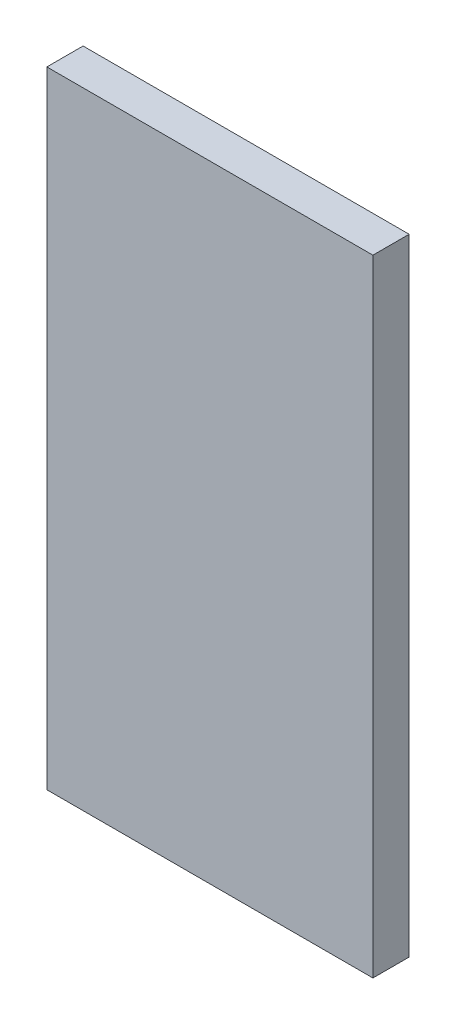
ISO-10303-21;
HEADER;
FILE_DESCRIPTION(('STEP AP214'),'2;1');
FILE_NAME('part.step','',(''),(''),'','','');
FILE_SCHEMA(('AUTOMOTIVE_DESIGN { 1 0 10303 214 1 1 1 1 }'));
ENDSEC;
DATA;
#1=APPLICATION_CONTEXT('core data for automotive mechanical design processes');
#2=APPLICATION_PROTOCOL_DEFINITION('international standard','automotive_design',2000,#1);
#3=PRODUCT_CONTEXT('',#1,'mechanical');
#4=PRODUCT('Part','Part','',(#3));
#5=PRODUCT_RELATED_PRODUCT_CATEGORY('part','',(#4));
#6=PRODUCT_DEFINITION_FORMATION('','',#4);
#7=PRODUCT_DEFINITION_CONTEXT('part definition',#1,'design');
#8=PRODUCT_DEFINITION('design','',#6,#7);
#9=PRODUCT_DEFINITION_SHAPE('','',#8);
#10=(LENGTH_UNIT() NAMED_UNIT(*) SI_UNIT(.MILLI.,.METRE.));
#11=(NAMED_UNIT(*) PLANE_ANGLE_UNIT() SI_UNIT($,.RADIAN.));
#12=(NAMED_UNIT(*) SI_UNIT($,.STERADIAN.) SOLID_ANGLE_UNIT());
#13=UNCERTAINTY_MEASURE_WITH_UNIT(LENGTH_MEASURE(1.E-05),#10,'distance_accuracy_value','');
#14=(GEOMETRIC_REPRESENTATION_CONTEXT(3) GLOBAL_UNCERTAINTY_ASSIGNED_CONTEXT((#13)) GLOBAL_UNIT_ASSIGNED_CONTEXT((#10,
#11,#12)) REPRESENTATION_CONTEXT('',''));
#15=CARTESIAN_POINT('',(0.,0.,0.));
#16=DIRECTION('',(0.,0.,1.));
#17=DIRECTION('',(1.,0.,0.));
#18=AXIS2_PLACEMENT_3D('',#15,#16,#17);
#19=CARTESIAN_POINT('',(-20.0205506400603,24.7765356739458,6.35));
#20=DIRECTION('',(1.,0.,0.));
#21=DIRECTION('',(0.,1.,0.));
#22=AXIS2_PLACEMENT_3D('',#19,#20,#21);
#23=PLANE('',#22);
#24=DIRECTION('',(0.,-1.,0.));
#25=VECTOR('',#24,1.);
#26=CARTESIAN_POINT('',(-20.0205506400603,24.7765356739458,0.));
#27=LINE('',#26,#25);
#28=CARTESIAN_POINT('',(-20.0205506400603,62.8765356739458,0.));
#29=VERTEX_POINT('',#28);
#30=CARTESIAN_POINT('',(-20.0205506400602,-46.8514643260542,0.));
#31=VERTEX_POINT('',#30);
#32=EDGE_CURVE('E95',#29,#31,#27,.T.);
#33=ORIENTED_EDGE('',*,*,#32,.T.);
#34=DIRECTION('',(0.,0.,-1.));
#35=VECTOR('',#34,1.);
#36=CARTESIAN_POINT('',(-20.0205506400602,-46.8514643260542,6.35));
#37=LINE('',#36,#35);
#38=CARTESIAN_POINT('',(-20.0205506400602,-46.8514643260542,6.35));
#39=VERTEX_POINT('',#38);
#40=EDGE_CURVE('E11',#39,#31,#37,.T.);
#41=ORIENTED_EDGE('',*,*,#40,.F.);
#42=DIRECTION('',(0.,-1.,0.));
#43=VECTOR('',#42,1.);
#44=CARTESIAN_POINT('',(-20.0205506400603,24.7765356739458,6.35));
#45=LINE('',#44,#43);
#46=CARTESIAN_POINT('',(-20.0205506400603,62.8765356739458,6.35));
#47=VERTEX_POINT('',#46);
#48=EDGE_CURVE('E89',#47,#39,#45,.T.);
#49=ORIENTED_EDGE('',*,*,#48,.F.);
#50=DIRECTION('',(0.,0.,1.));
#51=VECTOR('',#50,1.);
#52=CARTESIAN_POINT('',(-20.0205506400603,62.8765356739458,0.));
#53=LINE('',#52,#51);
#54=EDGE_CURVE('E100',#29,#47,#53,.T.);
#55=ORIENTED_EDGE('',*,*,#54,.F.);
#56=EDGE_LOOP('',(#33,#41,#49,#55));
#57=FACE_BOUND('',#56,.T.);
#58=ADVANCED_FACE('F39',(#57),#23,.F.);
#59=CARTESIAN_POINT('',(-20.0205506400602,-46.8514643260542,6.35));
#60=DIRECTION('',(0.,1.,0.));
#61=DIRECTION('',(0.,0.,1.));
#62=AXIS2_PLACEMENT_3D('',#59,#60,#61);
#63=PLANE('',#62);
#64=DIRECTION('',(1.,0.,0.));
#65=VECTOR('',#64,1.);
#66=CARTESIAN_POINT('',(-20.0205506400602,-46.8514643260542,0.));
#67=LINE('',#66,#65);
#68=CARTESIAN_POINT('',(37.1294493599398,-46.8514643260542,0.));
#69=VERTEX_POINT('',#68);
#70=EDGE_CURVE('E67',#31,#69,#67,.T.);
#71=ORIENTED_EDGE('',*,*,#70,.T.);
#72=DIRECTION('',(0.,0.,-1.));
#73=VECTOR('',#72,1.);
#74=CARTESIAN_POINT('',(37.1294493599398,-46.8514643260542,6.35));
#75=LINE('',#74,#73);
#76=CARTESIAN_POINT('',(37.1294493599398,-46.8514643260542,6.35));
#77=VERTEX_POINT('',#76);
#78=EDGE_CURVE('E48',#77,#69,#75,.T.);
#79=ORIENTED_EDGE('',*,*,#78,.F.);
#80=DIRECTION('',(1.,0.,0.));
#81=VECTOR('',#80,1.);
#82=CARTESIAN_POINT('',(-20.0205506400602,-46.8514643260542,6.35));
#83=LINE('',#82,#81);
#84=EDGE_CURVE('E56',#39,#77,#83,.T.);
#85=ORIENTED_EDGE('',*,*,#84,.F.);
#86=ORIENTED_EDGE('',*,*,#40,.T.);
#87=EDGE_LOOP('',(#71,#79,#85,#86));
#88=FACE_BOUND('',#87,.T.);
#89=ADVANCED_FACE('F122',(#88),#63,.F.);
#90=CARTESIAN_POINT('',(37.1294493599397,24.7765356739458,6.35));
#91=DIRECTION('',(-1.,0.,0.));
#92=DIRECTION('',(0.,-1.,0.));
#93=AXIS2_PLACEMENT_3D('',#90,#91,#92);
#94=PLANE('',#93);
#95=DIRECTION('',(0.,1.,0.));
#96=VECTOR('',#95,1.);
#97=CARTESIAN_POINT('',(37.1294493599397,24.7765356739458,0.));
#98=LINE('',#97,#96);
#99=CARTESIAN_POINT('',(37.1294493599397,62.8765356739458,0.));
#100=VERTEX_POINT('',#99);
#101=EDGE_CURVE('E83',#69,#100,#98,.T.);
#102=ORIENTED_EDGE('',*,*,#101,.T.);
#103=DIRECTION('',(0.,0.,-1.));
#104=VECTOR('',#103,1.);
#105=CARTESIAN_POINT('',(37.1294493599397,62.8765356739458,6.35));
#106=LINE('',#105,#104);
#107=CARTESIAN_POINT('',(37.1294493599397,62.8765356739458,6.35));
#108=VERTEX_POINT('',#107);
#109=EDGE_CURVE('E87',#108,#100,#106,.T.);
#110=ORIENTED_EDGE('',*,*,#109,.F.);
#111=DIRECTION('',(0.,1.,0.));
#112=VECTOR('',#111,1.);
#113=CARTESIAN_POINT('',(37.1294493599397,24.7765356739458,6.35));
#114=LINE('',#113,#112);
#115=EDGE_CURVE('E71',#77,#108,#114,.T.);
#116=ORIENTED_EDGE('',*,*,#115,.F.);
#117=ORIENTED_EDGE('',*,*,#78,.T.);
#118=EDGE_LOOP('',(#102,#110,#116,#117));
#119=FACE_BOUND('',#118,.T.);
#120=ADVANCED_FACE('F85',(#119),#94,.F.);
#121=CARTESIAN_POINT('',(0.,0.,6.35));
#122=DIRECTION('',(0.,0.,1.));
#123=DIRECTION('',(1.,0.,0.));
#124=AXIS2_PLACEMENT_3D('',#121,#122,#123);
#125=PLANE('',#124);
#126=ORIENTED_EDGE('',*,*,#48,.T.);
#127=ORIENTED_EDGE('',*,*,#84,.T.);
#128=ORIENTED_EDGE('',*,*,#115,.T.);
#129=DIRECTION('',(1.,0.,0.));
#130=VECTOR('',#129,1.);
#131=CARTESIAN_POINT('',(-20.0205506400603,62.8765356739458,6.35));
#132=LINE('',#131,#130);
#133=EDGE_CURVE('E103',#47,#108,#132,.T.);
#134=ORIENTED_EDGE('',*,*,#133,.F.);
#135=EDGE_LOOP('',(#126,#127,#128,#134));
#136=FACE_BOUND('',#135,.T.);
#137=ADVANCED_FACE('F125',(#136),#125,.T.);
#138=CARTESIAN_POINT('',(0.,0.,0.));
#139=DIRECTION('',(0.,0.,1.));
#140=DIRECTION('',(1.,0.,0.));
#141=AXIS2_PLACEMENT_3D('',#138,#139,#140);
#142=PLANE('',#141);
#143=ORIENTED_EDGE('',*,*,#32,.F.);
#144=DIRECTION('',(-1.,0.,0.));
#145=VECTOR('',#144,1.);
#146=CARTESIAN_POINT('',(37.1294493599397,62.8765356739458,0.));
#147=LINE('',#146,#145);
#148=EDGE_CURVE('E92',#100,#29,#147,.T.);
#149=ORIENTED_EDGE('',*,*,#148,.F.);
#150=ORIENTED_EDGE('',*,*,#101,.F.);
#151=ORIENTED_EDGE('',*,*,#70,.F.);
#152=EDGE_LOOP('',(#143,#149,#150,#151));
#153=FACE_BOUND('',#152,.T.);
#154=ADVANCED_FACE('F93',(#153),#142,.F.);
#155=CARTESIAN_POINT('',(0.,62.8765356739458,0.));
#156=DIRECTION('',(0.,1.,0.));
#157=DIRECTION('',(0.,0.,1.));
#158=AXIS2_PLACEMENT_3D('',#155,#156,#157);
#159=PLANE('',#158);
#160=ORIENTED_EDGE('',*,*,#109,.T.);
#161=ORIENTED_EDGE('',*,*,#148,.T.);
#162=ORIENTED_EDGE('',*,*,#54,.T.);
#163=ORIENTED_EDGE('',*,*,#133,.T.);
#164=EDGE_LOOP('',(#160,#161,#162,#163));
#165=FACE_BOUND('',#164,.T.);
#166=ADVANCED_FACE('F102',(#165),#159,.T.);
#167=CLOSED_SHELL('',(#58,#89,#120,#137,#154,#166));
#168=MANIFOLD_SOLID_BREP('B2',#167);
#169=ADVANCED_BREP_SHAPE_REPRESENTATION('',(#18,#168),#14);
#170=SHAPE_DEFINITION_REPRESENTATION(#9,#169);
ENDSEC;
END-ISO-10303-21;
